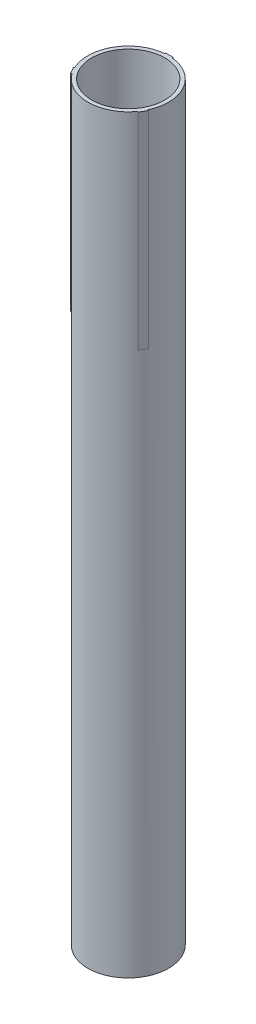
ISO-10303-21;
HEADER;
FILE_DESCRIPTION(('STEP AP214'),'2;1');
FILE_NAME('part.step','',(''),(''),'','','');
FILE_SCHEMA(('AUTOMOTIVE_DESIGN { 1 0 10303 214 1 1 1 1 }'));
ENDSEC;
DATA;
#1=APPLICATION_CONTEXT('core data for automotive mechanical design processes');
#2=APPLICATION_PROTOCOL_DEFINITION('international standard','automotive_design',2000,#1);
#3=PRODUCT_CONTEXT('',#1,'mechanical');
#4=PRODUCT('Part','Part','',(#3));
#5=PRODUCT_RELATED_PRODUCT_CATEGORY('part','',(#4));
#6=PRODUCT_DEFINITION_FORMATION('','',#4);
#7=PRODUCT_DEFINITION_CONTEXT('part definition',#1,'design');
#8=PRODUCT_DEFINITION('design','',#6,#7);
#9=PRODUCT_DEFINITION_SHAPE('','',#8);
#10=(LENGTH_UNIT() NAMED_UNIT(*) SI_UNIT(.MILLI.,.METRE.));
#11=(NAMED_UNIT(*) PLANE_ANGLE_UNIT() SI_UNIT($,.RADIAN.));
#12=(NAMED_UNIT(*) SI_UNIT($,.STERADIAN.) SOLID_ANGLE_UNIT());
#13=UNCERTAINTY_MEASURE_WITH_UNIT(LENGTH_MEASURE(1.E-05),#10,'distance_accuracy_value','');
#14=(GEOMETRIC_REPRESENTATION_CONTEXT(3) GLOBAL_UNCERTAINTY_ASSIGNED_CONTEXT((#13)) GLOBAL_UNIT_ASSIGNED_CONTEXT((#10,
#11,#12)) REPRESENTATION_CONTEXT('',''));
#15=CARTESIAN_POINT('',(0.,0.,0.));
#16=DIRECTION('',(0.,0.,1.));
#17=DIRECTION('',(1.,0.,0.));
#18=AXIS2_PLACEMENT_3D('',#15,#16,#17);
#19=CARTESIAN_POINT('',(0.,400.,0.));
#20=DIRECTION('',(0.,-1.,0.));
#21=DIRECTION('',(0.,0.,-1.));
#22=AXIS2_PLACEMENT_3D('',#19,#20,#21);
#23=CYLINDRICAL_SURFACE('',#22,21.5);
#24=CARTESIAN_POINT('',(0.,0.,0.));
#25=DIRECTION('',(0.,1.,0.));
#26=DIRECTION('',(0.,0.,1.));
#27=AXIS2_PLACEMENT_3D('',#24,#25,#26);
#28=CIRCLE('',#27,21.5);
#29=CARTESIAN_POINT('',(0.,0.,21.5));
#30=VERTEX_POINT('',#29);
#31=EDGE_CURVE('E209',#30,#30,#28,.T.);
#32=ORIENTED_EDGE('',*,*,#31,.T.);
#33=EDGE_LOOP('',(#32));
#34=FACE_BOUND('',#33,.T.);
#35=DIRECTION('',(0.,-1.,0.));
#36=VECTOR('',#35,1.);
#37=CARTESIAN_POINT('',(17.5388106414625,400.,12.4354381218725));
#38=LINE('',#37,#36);
#39=CARTESIAN_POINT('',(17.5388106414625,400.,12.4354381218725));
#40=VERTEX_POINT('',#39);
#41=CARTESIAN_POINT('',(17.5388106414625,290.,12.4354381218725));
#42=VERTEX_POINT('',#41);
#43=EDGE_CURVE('E160',#40,#42,#38,.T.);
#44=ORIENTED_EDGE('',*,*,#43,.F.);
#45=CARTESIAN_POINT('',(0.,400.,0.));
#46=DIRECTION('',(0.,1.,0.));
#47=DIRECTION('',(0.,0.,1.));
#48=AXIS2_PLACEMENT_3D('',#45,#46,#47);
#49=CIRCLE('',#48,21.5);
#50=CARTESIAN_POINT('',(-17.5394394454924,400.,12.4345512157819));
#51=VERTEX_POINT('',#50);
#52=EDGE_CURVE('E214',#51,#40,#49,.T.);
#53=ORIENTED_EDGE('',*,*,#52,.F.);
#54=DIRECTION('',(0.,-1.,0.));
#55=VECTOR('',#54,1.);
#56=CARTESIAN_POINT('',(-17.5394394454924,400.,12.4345512157819));
#57=LINE('',#56,#55);
#58=CARTESIAN_POINT('',(-17.5394394454924,290.,12.4345512157819));
#59=VERTEX_POINT('',#58);
#60=EDGE_CURVE('E183',#51,#59,#57,.T.);
#61=ORIENTED_EDGE('',*,*,#60,.T.);
#62=CARTESIAN_POINT('',(0.,290.,0.));
#63=DIRECTION('',(0.,-1.,0.));
#64=DIRECTION('',(0.,0.,-1.));
#65=AXIS2_PLACEMENT_3D('',#62,#63,#64);
#66=CIRCLE('',#65,21.5);
#67=CARTESIAN_POINT('',(-19.5388106414624,290.,8.97133650673504));
#68=VERTEX_POINT('',#67);
#69=EDGE_CURVE('E43',#59,#68,#66,.T.);
#70=ORIENTED_EDGE('',*,*,#69,.T.);
#71=DIRECTION('',(0.,-1.,0.));
#72=VECTOR('',#71,1.);
#73=CARTESIAN_POINT('',(-19.5388106414624,400.,8.97133650673503));
#74=LINE('',#73,#72);
#75=CARTESIAN_POINT('',(-19.5388106414624,400.,8.97133650673504));
#76=VERTEX_POINT('',#75);
#77=EDGE_CURVE('E186',#76,#68,#74,.T.);
#78=ORIENTED_EDGE('',*,*,#77,.F.);
#79=CARTESIAN_POINT('',(-1.99891751477953,400.,-21.4068757358263));
#80=VERTEX_POINT('',#79);
#81=EDGE_CURVE('E212',#80,#76,#49,.T.);
#82=ORIENTED_EDGE('',*,*,#81,.F.);
#83=DIRECTION('',(0.,-1.,0.));
#84=VECTOR('',#83,1.);
#85=CARTESIAN_POINT('',(-1.99891751477953,400.,-21.4068757358263));
#86=LINE('',#85,#84);
#87=CARTESIAN_POINT('',(-1.99891751477953,290.,-21.4068757358263));
#88=VERTEX_POINT('',#87);
#89=EDGE_CURVE('E219',#80,#88,#86,.T.);
#90=ORIENTED_EDGE('',*,*,#89,.T.);
#91=CARTESIAN_POINT('',(0.,290.,0.));
#92=DIRECTION('',(0.,-1.,0.));
#93=DIRECTION('',(0.,0.,-1.));
#94=AXIS2_PLACEMENT_3D('',#91,#92,#93);
#95=CIRCLE('',#94,21.5);
#96=CARTESIAN_POINT('',(2.,290.,-21.4067746286076));
#97=VERTEX_POINT('',#96);
#98=EDGE_CURVE('E58',#88,#97,#95,.T.);
#99=ORIENTED_EDGE('',*,*,#98,.T.);
#100=DIRECTION('',(0.,-1.,0.));
#101=VECTOR('',#100,1.);
#102=CARTESIAN_POINT('',(2.,400.,-21.4067746286076));
#103=LINE('',#102,#101);
#104=CARTESIAN_POINT('',(2.,400.,-21.4067746286076));
#105=VERTEX_POINT('',#104);
#106=EDGE_CURVE('E222',#105,#97,#103,.T.);
#107=ORIENTED_EDGE('',*,*,#106,.F.);
#108=CARTESIAN_POINT('',(19.5383569602721,400.,8.97232452004423));
#109=VERTEX_POINT('',#108);
#110=EDGE_CURVE('E215',#109,#105,#49,.T.);
#111=ORIENTED_EDGE('',*,*,#110,.F.);
#112=DIRECTION('',(0.,-1.,0.));
#113=VECTOR('',#112,1.);
#114=CARTESIAN_POINT('',(19.5383569602721,400.,8.97232452004423));
#115=LINE('',#114,#113);
#116=CARTESIAN_POINT('',(19.5383569602721,290.,8.97232452004423));
#117=VERTEX_POINT('',#116);
#118=EDGE_CURVE('E138',#109,#117,#115,.T.);
#119=ORIENTED_EDGE('',*,*,#118,.T.);
#120=CARTESIAN_POINT('',(0.,290.,0.));
#121=DIRECTION('',(0.,-1.,0.));
#122=DIRECTION('',(0.,0.,-1.));
#123=AXIS2_PLACEMENT_3D('',#120,#121,#122);
#124=CIRCLE('',#123,21.5);
#125=EDGE_CURVE('E11',#117,#42,#124,.T.);
#126=ORIENTED_EDGE('',*,*,#125,.T.);
#127=EDGE_LOOP('',(#44,#53,#61,#70,#78,#82,#90,#99,#107,#111,#119,#126));
#128=FACE_BOUND('',#127,.T.);
#129=ADVANCED_FACE('F36',(#34,#128),#23,.T.);
#130=CARTESIAN_POINT('',(0.,400.,0.));
#131=DIRECTION('',(0.,1.,0.));
#132=DIRECTION('',(0.,0.,1.));
#133=AXIS2_PLACEMENT_3D('',#130,#131,#132);
#134=PLANE('',#133);
#135=DIRECTION('',(-0.866025403784443,0.,-0.499999999999992));
#136=VECTOR('',#135,1.);
#137=CARTESIAN_POINT('',(19.9918343067971,400.,9.23413978813185));
#138=LINE('',#137,#136);
#139=CARTESIAN_POINT('',(19.9918343067971,400.,9.23413978813185));
#140=VERTEX_POINT('',#139);
#141=EDGE_CURVE('E133',#140,#109,#138,.T.);
#142=ORIENTED_EDGE('',*,*,#141,.T.);
#143=ORIENTED_EDGE('',*,*,#110,.T.);
#144=DIRECTION('',(0.,0.,1.));
#145=VECTOR('',#144,1.);
#146=CARTESIAN_POINT('',(2.,400.,-21.9305062720015));
#147=LINE('',#146,#145);
#148=CARTESIAN_POINT('',(2.,400.,-21.9305062720015));
#149=VERTEX_POINT('',#148);
#150=EDGE_CURVE('E188',#149,#105,#147,.T.);
#151=ORIENTED_EDGE('',*,*,#150,.F.);
#152=DIRECTION('',(-1.,0.,0.));
#153=VECTOR('',#152,1.);
#154=CARTESIAN_POINT('',(2.,400.,-21.9305062720015));
#155=LINE('',#154,#153);
#156=CARTESIAN_POINT('',(-1.99891751477953,400.,-21.9305062720015));
#157=VERTEX_POINT('',#156);
#158=EDGE_CURVE('E192',#149,#157,#155,.T.);
#159=ORIENTED_EDGE('',*,*,#158,.T.);
#160=DIRECTION('',(0.,0.,1.));
#161=VECTOR('',#160,1.);
#162=CARTESIAN_POINT('',(-1.99891751477953,400.,-21.9305062720015));
#163=LINE('',#162,#161);
#164=EDGE_CURVE('E50',#157,#80,#163,.T.);
#165=ORIENTED_EDGE('',*,*,#164,.T.);
#166=ORIENTED_EDGE('',*,*,#81,.T.);
#167=DIRECTION('',(0.866025403784436,0.,-0.500000000000004));
#168=VECTOR('',#167,1.);
#169=CARTESIAN_POINT('',(-19.9923755494072,400.,9.23320232843198));
#170=LINE('',#169,#168);
#171=CARTESIAN_POINT('',(-19.9923755494072,400.,9.23320232843198));
#172=VERTEX_POINT('',#171);
#173=EDGE_CURVE('E162',#172,#76,#170,.T.);
#174=ORIENTED_EDGE('',*,*,#173,.F.);
#175=DIRECTION('',(0.500000000000004,0.,0.866025403784436));
#176=VECTOR('',#175,1.);
#177=CARTESIAN_POINT('',(-19.9923755494072,400.,9.23320232843198));
#178=LINE('',#177,#176);
#179=CARTESIAN_POINT('',(-17.9929167920175,400.,12.6963664838696));
#180=VERTEX_POINT('',#179);
#181=EDGE_CURVE('E167',#172,#180,#178,.T.);
#182=ORIENTED_EDGE('',*,*,#181,.T.);
#183=DIRECTION('',(0.866025403784436,0.,-0.500000000000004));
#184=VECTOR('',#183,1.);
#185=CARTESIAN_POINT('',(-17.9929167920175,400.,12.6963664838696));
#186=LINE('',#185,#184);
#187=EDGE_CURVE('E175',#180,#51,#186,.T.);
#188=ORIENTED_EDGE('',*,*,#187,.T.);
#189=ORIENTED_EDGE('',*,*,#52,.T.);
#190=DIRECTION('',(-0.866025403784443,0.,-0.499999999999992));
#191=VECTOR('',#190,1.);
#192=CARTESIAN_POINT('',(17.9923755494074,400.,12.6973039435695));
#193=LINE('',#192,#191);
#194=CARTESIAN_POINT('',(17.9923755494074,400.,12.6973039435695));
#195=VERTEX_POINT('',#194);
#196=EDGE_CURVE('E154',#195,#40,#193,.T.);
#197=ORIENTED_EDGE('',*,*,#196,.F.);
#198=DIRECTION('',(0.499999999999992,0.,-0.866025403784443));
#199=VECTOR('',#198,1.);
#200=CARTESIAN_POINT('',(17.9923755494074,400.,12.6973039435695));
#201=LINE('',#200,#199);
#202=EDGE_CURVE('E157',#195,#140,#201,.T.);
#203=ORIENTED_EDGE('',*,*,#202,.T.);
#204=EDGE_LOOP('',(#142,#143,#151,#159,#165,#166,#174,#182,#188,#189,#197,#203));
#205=FACE_BOUND('',#204,.T.);
#206=CARTESIAN_POINT('',(0.,400.,0.));
#207=DIRECTION('',(0.,1.,0.));
#208=DIRECTION('',(0.,0.,1.));
#209=AXIS2_PLACEMENT_3D('',#206,#207,#208);
#210=CIRCLE('',#209,19.5);
#211=CARTESIAN_POINT('',(0.,400.,19.5));
#212=VERTEX_POINT('',#211);
#213=EDGE_CURVE('E206',#212,#212,#210,.T.);
#214=ORIENTED_EDGE('',*,*,#213,.F.);
#215=EDGE_LOOP('',(#214));
#216=FACE_BOUND('',#215,.T.);
#217=ADVANCED_FACE('F244',(#205,#216),#134,.T.);
#218=CARTESIAN_POINT('',(0.,0.,0.));
#219=DIRECTION('',(0.,1.,0.));
#220=DIRECTION('',(0.,0.,1.));
#221=AXIS2_PLACEMENT_3D('',#218,#219,#220);
#222=PLANE('',#221);
#223=ORIENTED_EDGE('',*,*,#31,.F.);
#224=EDGE_LOOP('',(#223));
#225=FACE_BOUND('',#224,.T.);
#226=CARTESIAN_POINT('',(0.,0.,0.));
#227=DIRECTION('',(0.,1.,0.));
#228=DIRECTION('',(0.,0.,1.));
#229=AXIS2_PLACEMENT_3D('',#226,#227,#228);
#230=CIRCLE('',#229,19.5);
#231=CARTESIAN_POINT('',(0.,0.,19.5));
#232=VERTEX_POINT('',#231);
#233=EDGE_CURVE('E205',#232,#232,#230,.T.);
#234=ORIENTED_EDGE('',*,*,#233,.T.);
#235=EDGE_LOOP('',(#234));
#236=FACE_BOUND('',#235,.T.);
#237=ADVANCED_FACE('F276',(#225,#236),#222,.F.);
#238=CARTESIAN_POINT('',(0.,400.,0.));
#239=DIRECTION('',(0.,-1.,0.));
#240=DIRECTION('',(0.,0.,-1.));
#241=AXIS2_PLACEMENT_3D('',#238,#239,#240);
#242=CYLINDRICAL_SURFACE('',#241,19.5);
#243=ORIENTED_EDGE('',*,*,#213,.T.);
#244=EDGE_LOOP('',(#243));
#245=FACE_BOUND('',#244,.T.);
#246=ORIENTED_EDGE('',*,*,#233,.F.);
#247=EDGE_LOOP('',(#246));
#248=FACE_BOUND('',#247,.T.);
#249=ADVANCED_FACE('F282',(#245,#248),#242,.F.);
#250=CARTESIAN_POINT('',(2.,290.,-21.9305062720015));
#251=DIRECTION('',(-1.,0.,0.));
#252=DIRECTION('',(0.,0.,1.));
#253=AXIS2_PLACEMENT_3D('',#250,#251,#252);
#254=PLANE('',#253);
#255=ORIENTED_EDGE('',*,*,#150,.T.);
#256=ORIENTED_EDGE('',*,*,#106,.T.);
#257=DIRECTION('',(0.,0.,1.));
#258=VECTOR('',#257,1.);
#259=CARTESIAN_POINT('',(2.,290.,-21.9305062720015));
#260=LINE('',#259,#258);
#261=CARTESIAN_POINT('',(2.,290.,-21.9305062720015));
#262=VERTEX_POINT('',#261);
#263=EDGE_CURVE('E189',#262,#97,#260,.T.);
#264=ORIENTED_EDGE('',*,*,#263,.F.);
#265=DIRECTION('',(0.,1.,0.));
#266=VECTOR('',#265,1.);
#267=CARTESIAN_POINT('',(2.,290.,-21.9305062720015));
#268=LINE('',#267,#266);
#269=EDGE_CURVE('E197',#262,#149,#268,.T.);
#270=ORIENTED_EDGE('',*,*,#269,.T.);
#271=EDGE_LOOP('',(#255,#256,#264,#270));
#272=FACE_BOUND('',#271,.T.);
#273=ADVANCED_FACE('F257',(#272),#254,.F.);
#274=CARTESIAN_POINT('',(-1.99891751477953,290.,-21.9305062720015));
#275=DIRECTION('',(-1.,0.,0.));
#276=DIRECTION('',(0.,0.,1.));
#277=AXIS2_PLACEMENT_3D('',#274,#275,#276);
#278=PLANE('',#277);
#279=ORIENTED_EDGE('',*,*,#89,.F.);
#280=ORIENTED_EDGE('',*,*,#164,.F.);
#281=DIRECTION('',(0.,1.,0.));
#282=VECTOR('',#281,1.);
#283=CARTESIAN_POINT('',(-1.99891751477953,290.,-21.9305062720015));
#284=LINE('',#283,#282);
#285=CARTESIAN_POINT('',(-1.99891751477953,290.,-21.9305062720015));
#286=VERTEX_POINT('',#285);
#287=EDGE_CURVE('E203',#286,#157,#284,.T.);
#288=ORIENTED_EDGE('',*,*,#287,.F.);
#289=DIRECTION('',(0.,0.,1.));
#290=VECTOR('',#289,1.);
#291=CARTESIAN_POINT('',(-1.99891751477953,290.,-21.9305062720015));
#292=LINE('',#291,#290);
#293=EDGE_CURVE('E191',#286,#88,#292,.T.);
#294=ORIENTED_EDGE('',*,*,#293,.T.);
#295=EDGE_LOOP('',(#279,#280,#288,#294));
#296=FACE_BOUND('',#295,.T.);
#297=ADVANCED_FACE('F248',(#296),#278,.T.);
#298=CARTESIAN_POINT('',(2.,290.,-21.9305062720015));
#299=DIRECTION('',(0.,0.,-1.));
#300=DIRECTION('',(-1.,0.,0.));
#301=AXIS2_PLACEMENT_3D('',#298,#299,#300);
#302=PLANE('',#301);
#303=ORIENTED_EDGE('',*,*,#158,.F.);
#304=ORIENTED_EDGE('',*,*,#269,.F.);
#305=DIRECTION('',(-1.,0.,0.));
#306=VECTOR('',#305,1.);
#307=CARTESIAN_POINT('',(2.,290.,-21.9305062720015));
#308=LINE('',#307,#306);
#309=EDGE_CURVE('E194',#262,#286,#308,.T.);
#310=ORIENTED_EDGE('',*,*,#309,.T.);
#311=ORIENTED_EDGE('',*,*,#287,.T.);
#312=EDGE_LOOP('',(#303,#304,#310,#311));
#313=FACE_BOUND('',#312,.T.);
#314=ADVANCED_FACE('F253',(#313),#302,.T.);
#315=CARTESIAN_POINT('',(0.,290.,0.));
#316=DIRECTION('',(0.,-1.,0.));
#317=DIRECTION('',(0.,0.,-1.));
#318=AXIS2_PLACEMENT_3D('',#315,#316,#317);
#319=PLANE('',#318);
#320=ORIENTED_EDGE('',*,*,#263,.T.);
#321=ORIENTED_EDGE('',*,*,#98,.F.);
#322=ORIENTED_EDGE('',*,*,#293,.F.);
#323=ORIENTED_EDGE('',*,*,#309,.F.);
#324=EDGE_LOOP('',(#320,#321,#322,#323));
#325=FACE_BOUND('',#324,.T.);
#326=ADVANCED_FACE('F250',(#325),#319,.T.);
#327=CARTESIAN_POINT('',(-19.9923755494072,290.,9.23320232843198));
#328=DIRECTION('',(0.500000000000004,0.,0.866025403784436));
#329=DIRECTION('',(0.866025403784436,0.,-0.500000000000004));
#330=AXIS2_PLACEMENT_3D('',#327,#328,#329);
#331=PLANE('',#330);
#332=ORIENTED_EDGE('',*,*,#173,.T.);
#333=ORIENTED_EDGE('',*,*,#77,.T.);
#334=DIRECTION('',(0.866025403784436,0.,-0.500000000000004));
#335=VECTOR('',#334,1.);
#336=CARTESIAN_POINT('',(-19.9923755494072,290.,9.23320232843198));
#337=LINE('',#336,#335);
#338=CARTESIAN_POINT('',(-19.9923755494072,290.,9.23320232843198));
#339=VERTEX_POINT('',#338);
#340=EDGE_CURVE('E163',#339,#68,#337,.T.);
#341=ORIENTED_EDGE('',*,*,#340,.F.);
#342=DIRECTION('',(0.,1.,0.));
#343=VECTOR('',#342,1.);
#344=CARTESIAN_POINT('',(-19.9923755494072,290.,9.23320232843198));
#345=LINE('',#344,#343);
#346=EDGE_CURVE('E173',#339,#172,#345,.T.);
#347=ORIENTED_EDGE('',*,*,#346,.T.);
#348=EDGE_LOOP('',(#332,#333,#341,#347));
#349=FACE_BOUND('',#348,.T.);
#350=ADVANCED_FACE('F243',(#349),#331,.F.);
#351=CARTESIAN_POINT('',(-17.9929167920175,290.,12.6963664838696));
#352=DIRECTION('',(0.500000000000004,0.,0.866025403784436));
#353=DIRECTION('',(0.866025403784436,0.,-0.500000000000004));
#354=AXIS2_PLACEMENT_3D('',#351,#352,#353);
#355=PLANE('',#354);
#356=ORIENTED_EDGE('',*,*,#60,.F.);
#357=ORIENTED_EDGE('',*,*,#187,.F.);
#358=DIRECTION('',(0.,1.,0.));
#359=VECTOR('',#358,1.);
#360=CARTESIAN_POINT('',(-17.9929167920175,290.,12.6963664838696));
#361=LINE('',#360,#359);
#362=CARTESIAN_POINT('',(-17.9929167920175,290.,12.6963664838696));
#363=VERTEX_POINT('',#362);
#364=EDGE_CURVE('E181',#363,#180,#361,.T.);
#365=ORIENTED_EDGE('',*,*,#364,.F.);
#366=DIRECTION('',(0.866025403784436,0.,-0.500000000000004));
#367=VECTOR('',#366,1.);
#368=CARTESIAN_POINT('',(-17.9929167920175,290.,12.6963664838696));
#369=LINE('',#368,#367);
#370=EDGE_CURVE('E166',#363,#59,#369,.T.);
#371=ORIENTED_EDGE('',*,*,#370,.T.);
#372=EDGE_LOOP('',(#356,#357,#365,#371));
#373=FACE_BOUND('',#372,.T.);
#374=ADVANCED_FACE('F236',(#373),#355,.T.);
#375=CARTESIAN_POINT('',(-19.9923755494072,290.,9.23320232843198));
#376=DIRECTION('',(-0.866025403784436,0.,0.500000000000004));
#377=DIRECTION('',(0.500000000000004,0.,0.866025403784436));
#378=AXIS2_PLACEMENT_3D('',#375,#376,#377);
#379=PLANE('',#378);
#380=ORIENTED_EDGE('',*,*,#181,.F.);
#381=ORIENTED_EDGE('',*,*,#346,.F.);
#382=DIRECTION('',(0.500000000000004,0.,0.866025403784436));
#383=VECTOR('',#382,1.);
#384=CARTESIAN_POINT('',(-19.9923755494072,290.,9.23320232843198));
#385=LINE('',#384,#383);
#386=EDGE_CURVE('E170',#339,#363,#385,.T.);
#387=ORIENTED_EDGE('',*,*,#386,.T.);
#388=ORIENTED_EDGE('',*,*,#364,.T.);
#389=EDGE_LOOP('',(#380,#381,#387,#388));
#390=FACE_BOUND('',#389,.T.);
#391=ADVANCED_FACE('F240',(#390),#379,.T.);
#392=CARTESIAN_POINT('',(0.,290.,0.));
#393=DIRECTION('',(0.,-1.,0.));
#394=DIRECTION('',(-0.866025403784436,0.,0.500000000000004));
#395=AXIS2_PLACEMENT_3D('',#392,#393,#394);
#396=PLANE('',#395);
#397=ORIENTED_EDGE('',*,*,#69,.F.);
#398=ORIENTED_EDGE('',*,*,#370,.F.);
#399=ORIENTED_EDGE('',*,*,#386,.F.);
#400=ORIENTED_EDGE('',*,*,#340,.T.);
#401=EDGE_LOOP('',(#397,#398,#399,#400));
#402=FACE_BOUND('',#401,.T.);
#403=ADVANCED_FACE('F232',(#402),#396,.T.);
#404=CARTESIAN_POINT('',(17.9923755494074,290.,12.6973039435695));
#405=DIRECTION('',(0.499999999999992,0.,-0.866025403784443));
#406=DIRECTION('',(-0.866025403784443,0.,-0.499999999999992));
#407=AXIS2_PLACEMENT_3D('',#404,#405,#406);
#408=PLANE('',#407);
#409=ORIENTED_EDGE('',*,*,#196,.T.);
#410=ORIENTED_EDGE('',*,*,#43,.T.);
#411=DIRECTION('',(-0.866025403784443,0.,-0.499999999999992));
#412=VECTOR('',#411,1.);
#413=CARTESIAN_POINT('',(17.9923755494074,290.,12.6973039435695));
#414=LINE('',#413,#412);
#415=CARTESIAN_POINT('',(17.9923755494074,290.,12.6973039435695));
#416=VERTEX_POINT('',#415);
#417=EDGE_CURVE('E146',#416,#42,#414,.T.);
#418=ORIENTED_EDGE('',*,*,#417,.F.);
#419=DIRECTION('',(0.,1.,0.));
#420=VECTOR('',#419,1.);
#421=CARTESIAN_POINT('',(17.9923755494074,290.,12.6973039435695));
#422=LINE('',#421,#420);
#423=EDGE_CURVE('E139',#416,#195,#422,.T.);
#424=ORIENTED_EDGE('',*,*,#423,.T.);
#425=EDGE_LOOP('',(#409,#410,#418,#424));
#426=FACE_BOUND('',#425,.T.);
#427=ADVANCED_FACE('F262',(#426),#408,.F.);
#428=CARTESIAN_POINT('',(19.9918343067971,290.,9.23413978813185));
#429=DIRECTION('',(0.499999999999992,0.,-0.866025403784443));
#430=DIRECTION('',(-0.866025403784443,0.,-0.499999999999992));
#431=AXIS2_PLACEMENT_3D('',#428,#429,#430);
#432=PLANE('',#431);
#433=ORIENTED_EDGE('',*,*,#118,.F.);
#434=ORIENTED_EDGE('',*,*,#141,.F.);
#435=DIRECTION('',(0.,1.,0.));
#436=VECTOR('',#435,1.);
#437=CARTESIAN_POINT('',(19.9918343067971,290.,9.23413978813185));
#438=LINE('',#437,#436);
#439=CARTESIAN_POINT('',(19.9918343067971,290.,9.23413978813185));
#440=VERTEX_POINT('',#439);
#441=EDGE_CURVE('E127',#440,#140,#438,.T.);
#442=ORIENTED_EDGE('',*,*,#441,.F.);
#443=DIRECTION('',(-0.866025403784443,0.,-0.499999999999992));
#444=VECTOR('',#443,1.);
#445=CARTESIAN_POINT('',(19.9918343067971,290.,9.23413978813185));
#446=LINE('',#445,#444);
#447=EDGE_CURVE('E130',#440,#117,#446,.T.);
#448=ORIENTED_EDGE('',*,*,#447,.T.);
#449=EDGE_LOOP('',(#433,#434,#442,#448));
#450=FACE_BOUND('',#449,.T.);
#451=ADVANCED_FACE('F129',(#450),#432,.T.);
#452=CARTESIAN_POINT('',(17.9923755494074,290.,12.6973039435695));
#453=DIRECTION('',(0.866025403784443,0.,0.499999999999992));
#454=DIRECTION('',(0.499999999999992,0.,-0.866025403784443));
#455=AXIS2_PLACEMENT_3D('',#452,#453,#454);
#456=PLANE('',#455);
#457=ORIENTED_EDGE('',*,*,#202,.F.);
#458=ORIENTED_EDGE('',*,*,#423,.F.);
#459=DIRECTION('',(0.499999999999992,0.,-0.866025403784443));
#460=VECTOR('',#459,1.);
#461=CARTESIAN_POINT('',(17.9923755494074,290.,12.6973039435695));
#462=LINE('',#461,#460);
#463=EDGE_CURVE('E145',#416,#440,#462,.T.);
#464=ORIENTED_EDGE('',*,*,#463,.T.);
#465=ORIENTED_EDGE('',*,*,#441,.T.);
#466=EDGE_LOOP('',(#457,#458,#464,#465));
#467=FACE_BOUND('',#466,.T.);
#468=ADVANCED_FACE('F148',(#467),#456,.T.);
#469=CARTESIAN_POINT('',(0.,290.,0.));
#470=DIRECTION('',(0.,-1.,0.));
#471=DIRECTION('',(0.866025403784443,0.,0.499999999999992));
#472=AXIS2_PLACEMENT_3D('',#469,#470,#471);
#473=PLANE('',#472);
#474=ORIENTED_EDGE('',*,*,#125,.F.);
#475=ORIENTED_EDGE('',*,*,#447,.F.);
#476=ORIENTED_EDGE('',*,*,#463,.F.);
#477=ORIENTED_EDGE('',*,*,#417,.T.);
#478=EDGE_LOOP('',(#474,#475,#476,#477));
#479=FACE_BOUND('',#478,.T.);
#480=ADVANCED_FACE('F143',(#479),#473,.T.);
#481=CLOSED_SHELL('',(#129,#217,#237,#249,#273,#297,#314,#326,#350,#374,#391,#403,#427,#451,
#468,#480));
#482=MANIFOLD_SOLID_BREP('B2',#481);
#483=ADVANCED_BREP_SHAPE_REPRESENTATION('',(#18,#482),#14);
#484=SHAPE_DEFINITION_REPRESENTATION(#9,#483);
ENDSEC;
END-ISO-10303-21;
